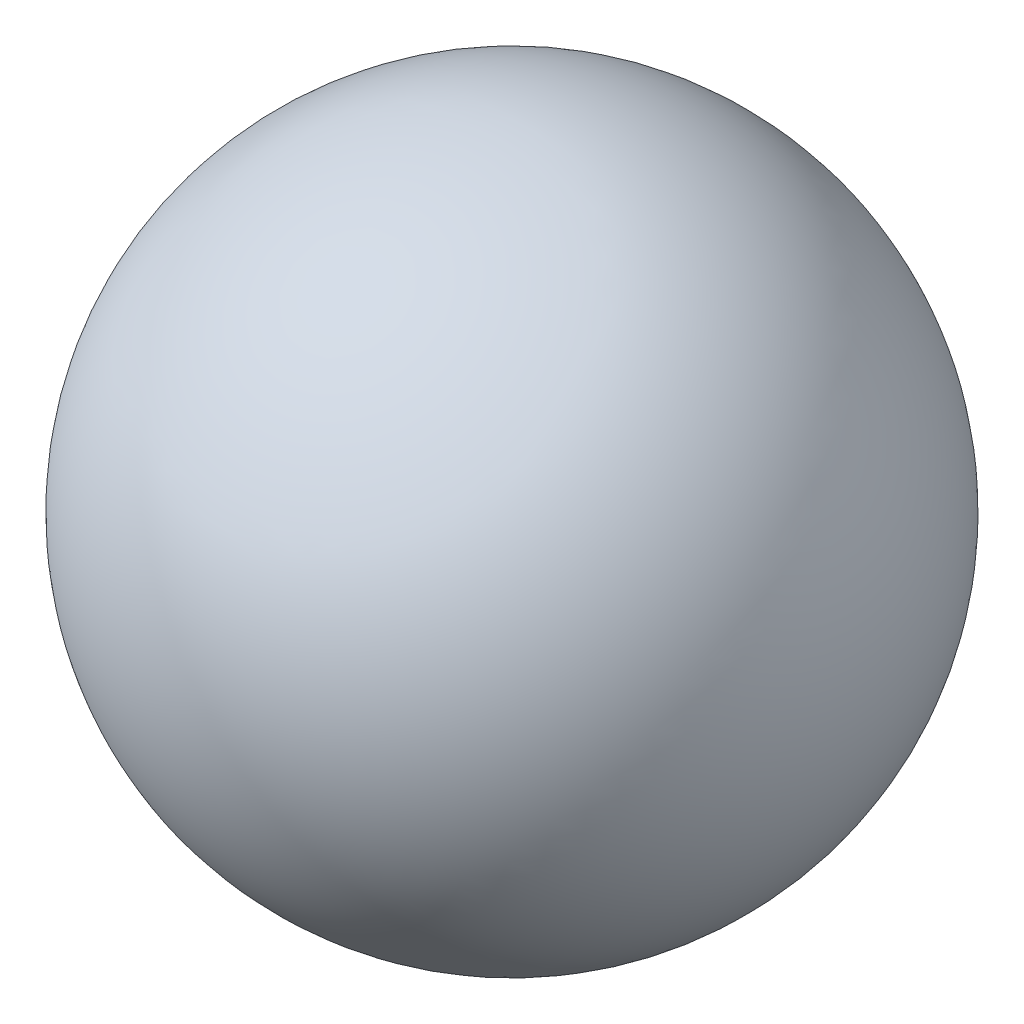
ISO-10303-21;
HEADER;
FILE_DESCRIPTION(('STEP AP214'),'2;1');
FILE_NAME('part.step','',(''),(''),'','','');
FILE_SCHEMA(('AUTOMOTIVE_DESIGN { 1 0 10303 214 1 1 1 1 }'));
ENDSEC;
DATA;
#1=APPLICATION_CONTEXT('core data for automotive mechanical design processes');
#2=APPLICATION_PROTOCOL_DEFINITION('international standard','automotive_design',2000,#1);
#3=PRODUCT_CONTEXT('',#1,'mechanical');
#4=PRODUCT('Part','Part','',(#3));
#5=PRODUCT_RELATED_PRODUCT_CATEGORY('part','',(#4));
#6=PRODUCT_DEFINITION_FORMATION('','',#4);
#7=PRODUCT_DEFINITION_CONTEXT('part definition',#1,'design');
#8=PRODUCT_DEFINITION('design','',#6,#7);
#9=PRODUCT_DEFINITION_SHAPE('','',#8);
#10=(LENGTH_UNIT() NAMED_UNIT(*) SI_UNIT(.MILLI.,.METRE.));
#11=(NAMED_UNIT(*) PLANE_ANGLE_UNIT() SI_UNIT($,.RADIAN.));
#12=(NAMED_UNIT(*) SI_UNIT($,.STERADIAN.) SOLID_ANGLE_UNIT());
#13=UNCERTAINTY_MEASURE_WITH_UNIT(LENGTH_MEASURE(1.E-05),#10,'distance_accuracy_value','');
#14=(GEOMETRIC_REPRESENTATION_CONTEXT(3) GLOBAL_UNCERTAINTY_ASSIGNED_CONTEXT((#13)) GLOBAL_UNIT_ASSIGNED_CONTEXT((#10,
#11,#12)) REPRESENTATION_CONTEXT('',''));
#15=CARTESIAN_POINT('',(0.,0.,0.));
#16=DIRECTION('',(0.,0.,1.));
#17=DIRECTION('',(1.,0.,0.));
#18=AXIS2_PLACEMENT_3D('',#15,#16,#17);
#19=CARTESIAN_POINT('',(0.,0.,0.));
#20=DIRECTION('',(0.,0.,-1.));
#21=DIRECTION('',(1.00000000000002,0.,0.));
#22=AXIS2_PLACEMENT_3D('',#19,#20,#21);
#23=SPHERICAL_SURFACE('',#22,5.1);
#24=CARTESIAN_POINT('',(0.,0.,-5.1));
#25=VERTEX_POINT('',#24);
#26=VERTEX_LOOP('',#25);
#27=FACE_BOUND('',#26,.T.);
#28=ADVANCED_FACE('F31',(#27),#23,.T.);
#29=CLOSED_SHELL('',(#28));
#30=MANIFOLD_SOLID_BREP('B2',#29);
#31=ADVANCED_BREP_SHAPE_REPRESENTATION('',(#18,#30),#14);
#32=SHAPE_DEFINITION_REPRESENTATION(#9,#31);
ENDSEC;
END-ISO-10303-21;
